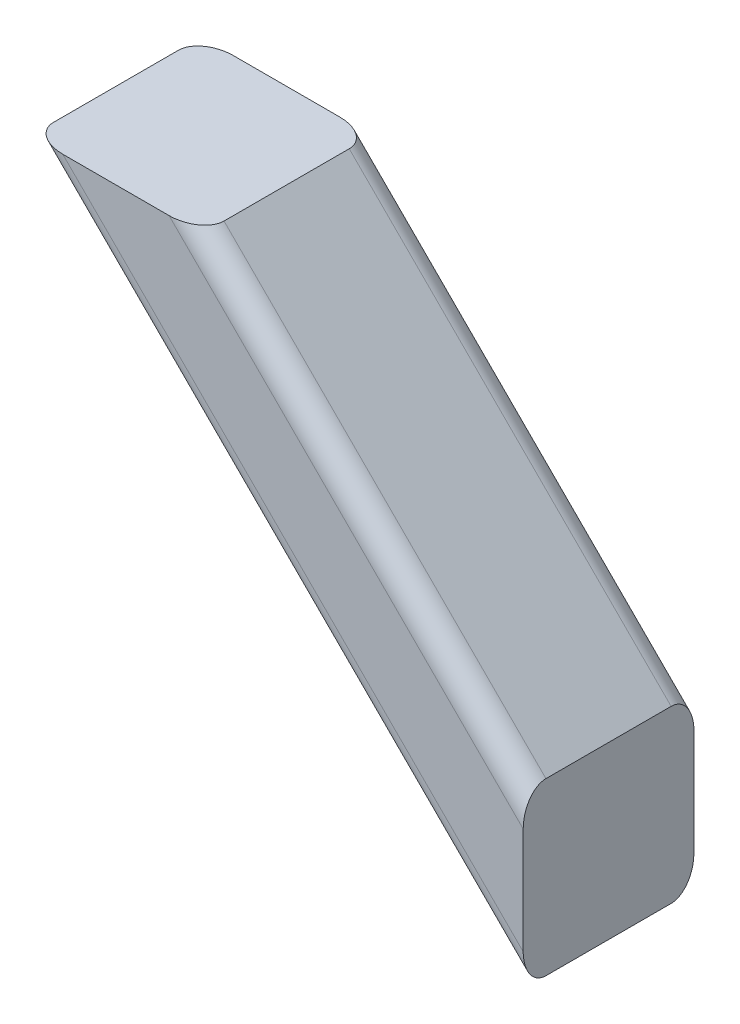
ISO-10303-21;
HEADER;
FILE_DESCRIPTION(('STEP AP214'),'2;1');
FILE_NAME('part.step','',(''),(''),'','','');
FILE_SCHEMA(('AUTOMOTIVE_DESIGN { 1 0 10303 214 1 1 1 1 }'));
ENDSEC;
DATA;
#1=APPLICATION_CONTEXT('core data for automotive mechanical design processes');
#2=APPLICATION_PROTOCOL_DEFINITION('international standard','automotive_design',2000,#1);
#3=PRODUCT_CONTEXT('',#1,'mechanical');
#4=PRODUCT('Part','Part','',(#3));
#5=PRODUCT_RELATED_PRODUCT_CATEGORY('part','',(#4));
#6=PRODUCT_DEFINITION_FORMATION('','',#4);
#7=PRODUCT_DEFINITION_CONTEXT('part definition',#1,'design');
#8=PRODUCT_DEFINITION('design','',#6,#7);
#9=PRODUCT_DEFINITION_SHAPE('','',#8);
#10=(LENGTH_UNIT() NAMED_UNIT(*) SI_UNIT(.MILLI.,.METRE.));
#11=(NAMED_UNIT(*) PLANE_ANGLE_UNIT() SI_UNIT($,.RADIAN.));
#12=(NAMED_UNIT(*) SI_UNIT($,.STERADIAN.) SOLID_ANGLE_UNIT());
#13=UNCERTAINTY_MEASURE_WITH_UNIT(LENGTH_MEASURE(1.E-05),#10,'distance_accuracy_value','');
#14=(GEOMETRIC_REPRESENTATION_CONTEXT(3) GLOBAL_UNCERTAINTY_ASSIGNED_CONTEXT((#13)) GLOBAL_UNIT_ASSIGNED_CONTEXT((#10,
#11,#12)) REPRESENTATION_CONTEXT('',''));
#15=CARTESIAN_POINT('',(0.,0.,0.));
#16=DIRECTION('',(0.,0.,1.));
#17=DIRECTION('',(1.,0.,0.));
#18=AXIS2_PLACEMENT_3D('',#15,#16,#17);
#19=CARTESIAN_POINT('',(-43.2842712474619,43.2842712474619,15.));
#20=DIRECTION('',(0.707106781186548,0.707106781186547,0.));
#21=DIRECTION('',(-0.707106781186547,0.707106781186548,0.));
#22=AXIS2_PLACEMENT_3D('',#19,#20,#21);
#23=PLANE('',#22);
#24=DIRECTION('',(0.,0.,-1.));
#25=VECTOR('',#24,1.);
#26=CARTESIAN_POINT('',(-43.2842712474619,43.2842712474619,15.));
#27=LINE('',#26,#25);
#28=CARTESIAN_POINT('',(-43.2842712474619,43.2842712474619,13.));
#29=VERTEX_POINT('',#28);
#30=CARTESIAN_POINT('',(-43.2842712474619,43.2842712474619,2.));
#31=VERTEX_POINT('',#30);
#32=EDGE_CURVE('E149',#29,#31,#27,.T.);
#33=ORIENTED_EDGE('',*,*,#32,.T.);
#34=DIRECTION('',(0.707106781186547,-0.707106781186548,0.));
#35=VECTOR('',#34,1.);
#36=CARTESIAN_POINT('',(-43.2842712474619,43.2842712474619,2.));
#37=LINE('',#36,#35);
#38=CARTESIAN_POINT('',(0.,0.,2.));
#39=VERTEX_POINT('',#38);
#40=EDGE_CURVE('E111',#31,#39,#37,.T.);
#41=ORIENTED_EDGE('',*,*,#40,.T.);
#42=DIRECTION('',(0.,0.,-1.));
#43=VECTOR('',#42,1.);
#44=CARTESIAN_POINT('',(0.,0.,15.));
#45=LINE('',#44,#43);
#46=CARTESIAN_POINT('',(0.,0.,13.));
#47=VERTEX_POINT('',#46);
#48=EDGE_CURVE('E103',#47,#39,#45,.T.);
#49=ORIENTED_EDGE('',*,*,#48,.F.);
#50=DIRECTION('',(0.707106781186547,-0.707106781186548,0.));
#51=VECTOR('',#50,1.);
#52=CARTESIAN_POINT('',(-43.2842712474619,43.2842712474619,13.));
#53=LINE('',#52,#51);
#54=EDGE_CURVE('E116',#47,#29,#53,.F.);
#55=ORIENTED_EDGE('',*,*,#54,.T.);
#56=EDGE_LOOP('',(#33,#41,#49,#55));
#57=FACE_BOUND('',#56,.T.);
#58=ADVANCED_FACE('F33',(#57),#23,.F.);
#59=CARTESIAN_POINT('',(0.,0.,15.));
#60=DIRECTION('',(-1.,0.,0.));
#61=DIRECTION('',(0.,0.,1.));
#62=AXIS2_PLACEMENT_3D('',#59,#60,#61);
#63=PLANE('',#62);
#64=ORIENTED_EDGE('',*,*,#48,.T.);
#65=CARTESIAN_POINT('',(0.,2.82842712474619,2.));
#66=DIRECTION('',(-1.,0.,0.));
#67=DIRECTION('',(0.,-1.,0.));
#68=AXIS2_PLACEMENT_3D('',#65,#66,#67);
#69=ELLIPSE('',#68,2.82842712474619,2.);
#70=CARTESIAN_POINT('',(0.,2.82842712474619,0.));
#71=VERTEX_POINT('',#70);
#72=EDGE_CURVE('E130',#39,#71,#69,.F.);
#73=ORIENTED_EDGE('',*,*,#72,.T.);
#74=DIRECTION('',(0.,1.,0.));
#75=VECTOR('',#74,1.);
#76=CARTESIAN_POINT('',(0.,0.,0.));
#77=LINE('',#76,#75);
#78=CARTESIAN_POINT('',(0.,12.1715728752538,0.));
#79=VERTEX_POINT('',#78);
#80=EDGE_CURVE('E156',#71,#79,#77,.T.);
#81=ORIENTED_EDGE('',*,*,#80,.T.);
#82=CARTESIAN_POINT('',(0.,12.1715728752538,2.));
#83=DIRECTION('',(-1.,0.,0.));
#84=DIRECTION('',(0.,1.,0.));
#85=AXIS2_PLACEMENT_3D('',#82,#83,#84);
#86=ELLIPSE('',#85,2.82842712474619,2.);
#87=CARTESIAN_POINT('',(0.,15.,2.));
#88=VERTEX_POINT('',#87);
#89=EDGE_CURVE('E128',#79,#88,#86,.F.);
#90=ORIENTED_EDGE('',*,*,#89,.T.);
#91=DIRECTION('',(0.,0.,-1.));
#92=VECTOR('',#91,1.);
#93=CARTESIAN_POINT('',(0.,15.,15.));
#94=LINE('',#93,#92);
#95=CARTESIAN_POINT('',(0.,15.,13.));
#96=VERTEX_POINT('',#95);
#97=EDGE_CURVE('E119',#96,#88,#94,.T.);
#98=ORIENTED_EDGE('',*,*,#97,.F.);
#99=CARTESIAN_POINT('',(0.,12.1715728752538,13.));
#100=DIRECTION('',(-1.,0.,0.));
#101=DIRECTION('',(0.,-1.,0.));
#102=AXIS2_PLACEMENT_3D('',#99,#100,#101);
#103=ELLIPSE('',#102,2.82842712474619,2.);
#104=CARTESIAN_POINT('',(0.,12.1715728752538,15.));
#105=VERTEX_POINT('',#104);
#106=EDGE_CURVE('E110',#96,#105,#103,.F.);
#107=ORIENTED_EDGE('',*,*,#106,.T.);
#108=DIRECTION('',(0.,1.,0.));
#109=VECTOR('',#108,1.);
#110=CARTESIAN_POINT('',(0.,0.,15.));
#111=LINE('',#110,#109);
#112=CARTESIAN_POINT('',(0.,2.82842712474619,15.));
#113=VERTEX_POINT('',#112);
#114=EDGE_CURVE('E105',#113,#105,#111,.T.);
#115=ORIENTED_EDGE('',*,*,#114,.F.);
#116=CARTESIAN_POINT('',(0.,2.82842712474619,13.));
#117=DIRECTION('',(-1.,0.,0.));
#118=DIRECTION('',(0.,1.,0.));
#119=AXIS2_PLACEMENT_3D('',#116,#117,#118);
#120=ELLIPSE('',#119,2.82842712474619,2.);
#121=EDGE_CURVE('E100',#113,#47,#120,.F.);
#122=ORIENTED_EDGE('',*,*,#121,.T.);
#123=EDGE_LOOP('',(#64,#73,#81,#90,#98,#107,#115,#122));
#124=FACE_BOUND('',#123,.T.);
#125=ADVANCED_FACE('F102',(#124),#63,.F.);
#126=CARTESIAN_POINT('',(0.,15.,15.));
#127=DIRECTION('',(-0.707106781186549,-0.707106781186546,0.));
#128=DIRECTION('',(0.707106781186546,-0.707106781186549,0.));
#129=AXIS2_PLACEMENT_3D('',#126,#127,#128);
#130=PLANE('',#129);
#131=ORIENTED_EDGE('',*,*,#97,.T.);
#132=DIRECTION('',(-0.707106781186546,0.707106781186549,0.));
#133=VECTOR('',#132,1.);
#134=CARTESIAN_POINT('',(0.,15.,2.));
#135=LINE('',#134,#133);
#136=CARTESIAN_POINT('',(-28.2842712474619,43.2842712474619,2.));
#137=VERTEX_POINT('',#136);
#138=EDGE_CURVE('E143',#88,#137,#135,.T.);
#139=ORIENTED_EDGE('',*,*,#138,.T.);
#140=DIRECTION('',(0.,0.,-1.));
#141=VECTOR('',#140,1.);
#142=CARTESIAN_POINT('',(-28.2842712474619,43.2842712474619,15.));
#143=LINE('',#142,#141);
#144=CARTESIAN_POINT('',(-28.2842712474619,43.2842712474619,13.));
#145=VERTEX_POINT('',#144);
#146=EDGE_CURVE('E151',#145,#137,#143,.T.);
#147=ORIENTED_EDGE('',*,*,#146,.F.);
#148=DIRECTION('',(-0.707106781186546,0.707106781186549,0.));
#149=VECTOR('',#148,1.);
#150=CARTESIAN_POINT('',(0.,15.,13.));
#151=LINE('',#150,#149);
#152=EDGE_CURVE('E141',#145,#96,#151,.F.);
#153=ORIENTED_EDGE('',*,*,#152,.T.);
#154=EDGE_LOOP('',(#131,#139,#147,#153));
#155=FACE_BOUND('',#154,.T.);
#156=ADVANCED_FACE('F164',(#155),#130,.F.);
#157=CARTESIAN_POINT('',(-28.2842712474619,43.2842712474619,15.));
#158=DIRECTION('',(0.,-1.,0.));
#159=DIRECTION('',(0.,0.,-1.));
#160=AXIS2_PLACEMENT_3D('',#157,#158,#159);
#161=PLANE('',#160);
#162=DIRECTION('',(-1.,0.,0.));
#163=VECTOR('',#162,1.);
#164=CARTESIAN_POINT('',(-28.2842712474619,43.2842712474619,0.));
#165=LINE('',#164,#163);
#166=CARTESIAN_POINT('',(-31.112698372208,43.2842712474619,0.));
#167=VERTEX_POINT('',#166);
#168=CARTESIAN_POINT('',(-40.4558441227157,43.2842712474619,0.));
#169=VERTEX_POINT('',#168);
#170=EDGE_CURVE('E153',#167,#169,#165,.T.);
#171=ORIENTED_EDGE('',*,*,#170,.T.);
#172=CARTESIAN_POINT('',(-40.4558441227157,43.2842712474619,2.));
#173=DIRECTION('',(0.,-1.,0.));
#174=DIRECTION('',(1.,0.,0.));
#175=AXIS2_PLACEMENT_3D('',#172,#173,#174);
#176=ELLIPSE('',#175,2.82842712474619,2.);
#177=EDGE_CURVE('E139',#169,#31,#176,.F.);
#178=ORIENTED_EDGE('',*,*,#177,.T.);
#179=ORIENTED_EDGE('',*,*,#32,.F.);
#180=CARTESIAN_POINT('',(-40.4558441227157,43.2842712474619,13.));
#181=DIRECTION('',(0.,-1.,0.));
#182=DIRECTION('',(-1.,0.,0.));
#183=AXIS2_PLACEMENT_3D('',#180,#181,#182);
#184=ELLIPSE('',#183,2.82842712474619,2.);
#185=CARTESIAN_POINT('',(-40.4558441227157,43.2842712474619,15.));
#186=VERTEX_POINT('',#185);
#187=EDGE_CURVE('E122',#29,#186,#184,.F.);
#188=ORIENTED_EDGE('',*,*,#187,.T.);
#189=DIRECTION('',(-1.,0.,0.));
#190=VECTOR('',#189,1.);
#191=CARTESIAN_POINT('',(-28.2842712474619,43.2842712474619,15.));
#192=LINE('',#191,#190);
#193=CARTESIAN_POINT('',(-31.112698372208,43.2842712474619,15.));
#194=VERTEX_POINT('',#193);
#195=EDGE_CURVE('E148',#194,#186,#192,.T.);
#196=ORIENTED_EDGE('',*,*,#195,.F.);
#197=CARTESIAN_POINT('',(-31.112698372208,43.2842712474619,13.));
#198=DIRECTION('',(0.,-1.,0.));
#199=DIRECTION('',(1.,0.,0.));
#200=AXIS2_PLACEMENT_3D('',#197,#198,#199);
#201=ELLIPSE('',#200,2.82842712474619,2.);
#202=EDGE_CURVE('E56',#194,#145,#201,.F.);
#203=ORIENTED_EDGE('',*,*,#202,.T.);
#204=ORIENTED_EDGE('',*,*,#146,.T.);
#205=CARTESIAN_POINT('',(-31.112698372208,43.2842712474619,2.));
#206=DIRECTION('',(0.,-1.,0.));
#207=DIRECTION('',(-1.,0.,0.));
#208=AXIS2_PLACEMENT_3D('',#205,#206,#207);
#209=ELLIPSE('',#208,2.82842712474619,2.);
#210=EDGE_CURVE('E48',#137,#167,#209,.F.);
#211=ORIENTED_EDGE('',*,*,#210,.T.);
#212=EDGE_LOOP('',(#171,#178,#179,#188,#196,#203,#204,#211));
#213=FACE_BOUND('',#212,.T.);
#214=ADVANCED_FACE('F177',(#213),#161,.F.);
#215=CARTESIAN_POINT('',(0.,0.,15.));
#216=DIRECTION('',(0.,0.,1.));
#217=DIRECTION('',(1.,0.,0.));
#218=AXIS2_PLACEMENT_3D('',#215,#216,#217);
#219=PLANE('',#218);
#220=ORIENTED_EDGE('',*,*,#114,.T.);
#221=DIRECTION('',(-0.707106781186546,0.707106781186549,0.));
#222=VECTOR('',#221,1.);
#223=CARTESIAN_POINT('',(-29.698484809835,41.8700576850888,15.));
#224=LINE('',#223,#222);
#225=EDGE_CURVE('E11',#105,#194,#224,.T.);
#226=ORIENTED_EDGE('',*,*,#225,.T.);
#227=ORIENTED_EDGE('',*,*,#195,.T.);
#228=DIRECTION('',(0.707106781186547,-0.707106781186548,0.));
#229=VECTOR('',#228,1.);
#230=CARTESIAN_POINT('',(1.4142135623731,1.41421356237309,15.));
#231=LINE('',#230,#229);
#232=EDGE_CURVE('E41',#186,#113,#231,.T.);
#233=ORIENTED_EDGE('',*,*,#232,.T.);
#234=EDGE_LOOP('',(#220,#226,#227,#233));
#235=FACE_BOUND('',#234,.T.);
#236=ADVANCED_FACE('F146',(#235),#219,.T.);
#237=CARTESIAN_POINT('',(0.,0.,0.));
#238=DIRECTION('',(0.,0.,1.));
#239=DIRECTION('',(1.,0.,0.));
#240=AXIS2_PLACEMENT_3D('',#237,#238,#239);
#241=PLANE('',#240);
#242=ORIENTED_EDGE('',*,*,#80,.F.);
#243=DIRECTION('',(0.707106781186547,-0.707106781186548,0.));
#244=VECTOR('',#243,1.);
#245=CARTESIAN_POINT('',(1.4142135623731,1.41421356237309,0.));
#246=LINE('',#245,#244);
#247=EDGE_CURVE('E134',#71,#169,#246,.F.);
#248=ORIENTED_EDGE('',*,*,#247,.T.);
#249=ORIENTED_EDGE('',*,*,#170,.F.);
#250=DIRECTION('',(-0.707106781186546,0.707106781186549,0.));
#251=VECTOR('',#250,1.);
#252=CARTESIAN_POINT('',(6.0857864376269,6.08578643762688,0.));
#253=LINE('',#252,#251);
#254=EDGE_CURVE('E132',#167,#79,#253,.F.);
#255=ORIENTED_EDGE('',*,*,#254,.T.);
#256=EDGE_LOOP('',(#242,#248,#249,#255));
#257=FACE_BOUND('',#256,.T.);
#258=ADVANCED_FACE('F172',(#257),#241,.F.);
#259=CARTESIAN_POINT('',(-41.8700576850888,44.698484809835,2.));
#260=DIRECTION('',(0.707106781186547,-0.707106781186548,0.));
#261=DIRECTION('',(0.707106781186548,0.707106781186547,0.));
#262=AXIS2_PLACEMENT_3D('',#259,#260,#261);
#263=CYLINDRICAL_SURFACE('',#262,2.);
#264=ORIENTED_EDGE('',*,*,#177,.F.);
#265=ORIENTED_EDGE('',*,*,#247,.F.);
#266=ORIENTED_EDGE('',*,*,#72,.F.);
#267=ORIENTED_EDGE('',*,*,#40,.F.);
#268=EDGE_LOOP('',(#264,#265,#266,#267));
#269=FACE_BOUND('',#268,.T.);
#270=ADVANCED_FACE('F176',(#269),#263,.T.);
#271=CARTESIAN_POINT('',(-1.4142135623731,13.5857864376269,2.));
#272=DIRECTION('',(-0.707106781186546,0.707106781186549,0.));
#273=DIRECTION('',(-0.707106781186549,-0.707106781186546,0.));
#274=AXIS2_PLACEMENT_3D('',#271,#272,#273);
#275=CYLINDRICAL_SURFACE('',#274,2.);
#276=ORIENTED_EDGE('',*,*,#89,.F.);
#277=ORIENTED_EDGE('',*,*,#254,.F.);
#278=ORIENTED_EDGE('',*,*,#210,.F.);
#279=ORIENTED_EDGE('',*,*,#138,.F.);
#280=EDGE_LOOP('',(#276,#277,#278,#279));
#281=FACE_BOUND('',#280,.T.);
#282=ADVANCED_FACE('F168',(#281),#275,.T.);
#283=CARTESIAN_POINT('',(6.0857864376269,6.08578643762688,13.));
#284=DIRECTION('',(0.707106781186546,-0.707106781186549,0.));
#285=DIRECTION('',(0.707106781186549,0.707106781186546,0.));
#286=AXIS2_PLACEMENT_3D('',#283,#284,#285);
#287=CYLINDRICAL_SURFACE('',#286,2.);
#288=ORIENTED_EDGE('',*,*,#106,.F.);
#289=ORIENTED_EDGE('',*,*,#152,.F.);
#290=ORIENTED_EDGE('',*,*,#202,.F.);
#291=ORIENTED_EDGE('',*,*,#225,.F.);
#292=EDGE_LOOP('',(#288,#289,#290,#291));
#293=FACE_BOUND('',#292,.T.);
#294=ADVANCED_FACE('F179',(#293),#287,.T.);
#295=CARTESIAN_POINT('',(1.4142135623731,1.41421356237309,13.));
#296=DIRECTION('',(-0.707106781186547,0.707106781186548,0.));
#297=DIRECTION('',(-0.707106781186548,-0.707106781186547,0.));
#298=AXIS2_PLACEMENT_3D('',#295,#296,#297);
#299=CYLINDRICAL_SURFACE('',#298,2.);
#300=ORIENTED_EDGE('',*,*,#187,.F.);
#301=ORIENTED_EDGE('',*,*,#54,.F.);
#302=ORIENTED_EDGE('',*,*,#121,.F.);
#303=ORIENTED_EDGE('',*,*,#232,.F.);
#304=EDGE_LOOP('',(#300,#301,#302,#303));
#305=FACE_BOUND('',#304,.T.);
#306=ADVANCED_FACE('F35',(#305),#299,.T.);
#307=CLOSED_SHELL('',(#58,#125,#156,#214,#236,#258,#270,#282,#294,#306));
#308=MANIFOLD_SOLID_BREP('B2',#307);
#309=ADVANCED_BREP_SHAPE_REPRESENTATION('',(#18,#308),#14);
#310=SHAPE_DEFINITION_REPRESENTATION(#9,#309);
ENDSEC;
END-ISO-10303-21;
